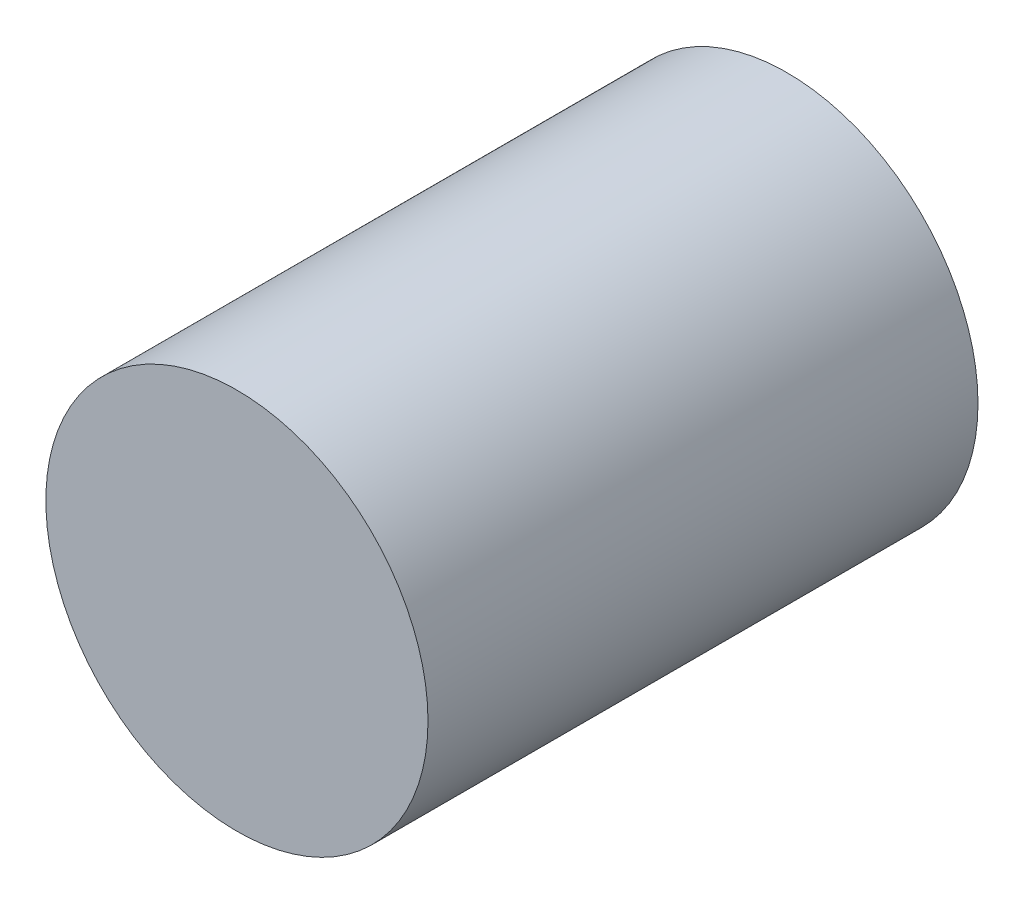
ISO-10303-21;
HEADER;
FILE_DESCRIPTION(('STEP AP214'),'2;1');
FILE_NAME('part.step','',(''),(''),'','','');
FILE_SCHEMA(('AUTOMOTIVE_DESIGN { 1 0 10303 214 1 1 1 1 }'));
ENDSEC;
DATA;
#1=APPLICATION_CONTEXT('core data for automotive mechanical design processes');
#2=APPLICATION_PROTOCOL_DEFINITION('international standard','automotive_design',2000,#1);
#3=PRODUCT_CONTEXT('',#1,'mechanical');
#4=PRODUCT('Part','Part','',(#3));
#5=PRODUCT_RELATED_PRODUCT_CATEGORY('part','',(#4));
#6=PRODUCT_DEFINITION_FORMATION('','',#4);
#7=PRODUCT_DEFINITION_CONTEXT('part definition',#1,'design');
#8=PRODUCT_DEFINITION('design','',#6,#7);
#9=PRODUCT_DEFINITION_SHAPE('','',#8);
#10=(LENGTH_UNIT() NAMED_UNIT(*) SI_UNIT(.MILLI.,.METRE.));
#11=(NAMED_UNIT(*) PLANE_ANGLE_UNIT() SI_UNIT($,.RADIAN.));
#12=(NAMED_UNIT(*) SI_UNIT($,.STERADIAN.) SOLID_ANGLE_UNIT());
#13=UNCERTAINTY_MEASURE_WITH_UNIT(LENGTH_MEASURE(1.E-05),#10,'distance_accuracy_value','');
#14=(GEOMETRIC_REPRESENTATION_CONTEXT(3) GLOBAL_UNCERTAINTY_ASSIGNED_CONTEXT((#13)) GLOBAL_UNIT_ASSIGNED_CONTEXT((#10,
#11,#12)) REPRESENTATION_CONTEXT('',''));
#15=CARTESIAN_POINT('',(0.,0.,0.));
#16=DIRECTION('',(0.,0.,1.));
#17=DIRECTION('',(1.,0.,0.));
#18=AXIS2_PLACEMENT_3D('',#15,#16,#17);
#19=CARTESIAN_POINT('',(-41.009085145788,15.2405421871435,21.));
#20=DIRECTION('',(0.,0.,-1.));
#21=DIRECTION('',(-1.,0.,0.));
#22=AXIS2_PLACEMENT_3D('',#19,#20,#21);
#23=CYLINDRICAL_SURFACE('',#22,7.29565053032137);
#24=CARTESIAN_POINT('',(-41.009085145788,15.2405421871435,21.));
#25=DIRECTION('',(0.,0.,1.));
#26=DIRECTION('',(1.,0.,0.));
#27=AXIS2_PLACEMENT_3D('',#24,#25,#26);
#28=CIRCLE('',#27,7.29565053032137);
#29=CARTESIAN_POINT('',(-33.7134346154667,15.2405421871435,21.));
#30=VERTEX_POINT('',#29);
#31=EDGE_CURVE('E10',#30,#30,#28,.T.);
#32=ORIENTED_EDGE('',*,*,#31,.F.);
#33=EDGE_LOOP('',(#32));
#34=FACE_BOUND('',#33,.T.);
#35=CARTESIAN_POINT('',(-41.009085145788,15.2405421871435,0.));
#36=DIRECTION('',(0.,0.,1.));
#37=DIRECTION('',(1.,0.,0.));
#38=AXIS2_PLACEMENT_3D('',#35,#36,#37);
#39=CIRCLE('',#38,7.29565053032137);
#40=CARTESIAN_POINT('',(-33.7134346154667,15.2405421871435,0.));
#41=VERTEX_POINT('',#40);
#42=EDGE_CURVE('E36',#41,#41,#39,.T.);
#43=ORIENTED_EDGE('',*,*,#42,.T.);
#44=EDGE_LOOP('',(#43));
#45=FACE_BOUND('',#44,.T.);
#46=ADVANCED_FACE('F33',(#34,#45),#23,.T.);
#47=CARTESIAN_POINT('',(-41.009085145788,15.2405421871435,21.));
#48=DIRECTION('',(0.,0.,1.));
#49=DIRECTION('',(1.,0.,0.));
#50=AXIS2_PLACEMENT_3D('',#47,#48,#49);
#51=PLANE('',#50);
#52=ORIENTED_EDGE('',*,*,#31,.T.);
#53=EDGE_LOOP('',(#52));
#54=FACE_BOUND('',#53,.T.);
#55=ADVANCED_FACE('F48',(#54),#51,.T.);
#56=CARTESIAN_POINT('',(-41.009085145788,15.2405421871435,0.));
#57=DIRECTION('',(0.,0.,1.));
#58=DIRECTION('',(1.,0.,0.));
#59=AXIS2_PLACEMENT_3D('',#56,#57,#58);
#60=PLANE('',#59);
#61=ORIENTED_EDGE('',*,*,#42,.F.);
#62=EDGE_LOOP('',(#61));
#63=FACE_BOUND('',#62,.T.);
#64=ADVANCED_FACE('F46',(#63),#60,.F.);
#65=CLOSED_SHELL('',(#46,#55,#64));
#66=MANIFOLD_SOLID_BREP('B2',#65);
#67=ADVANCED_BREP_SHAPE_REPRESENTATION('',(#18,#66),#14);
#68=SHAPE_DEFINITION_REPRESENTATION(#9,#67);
ENDSEC;
END-ISO-10303-21;
